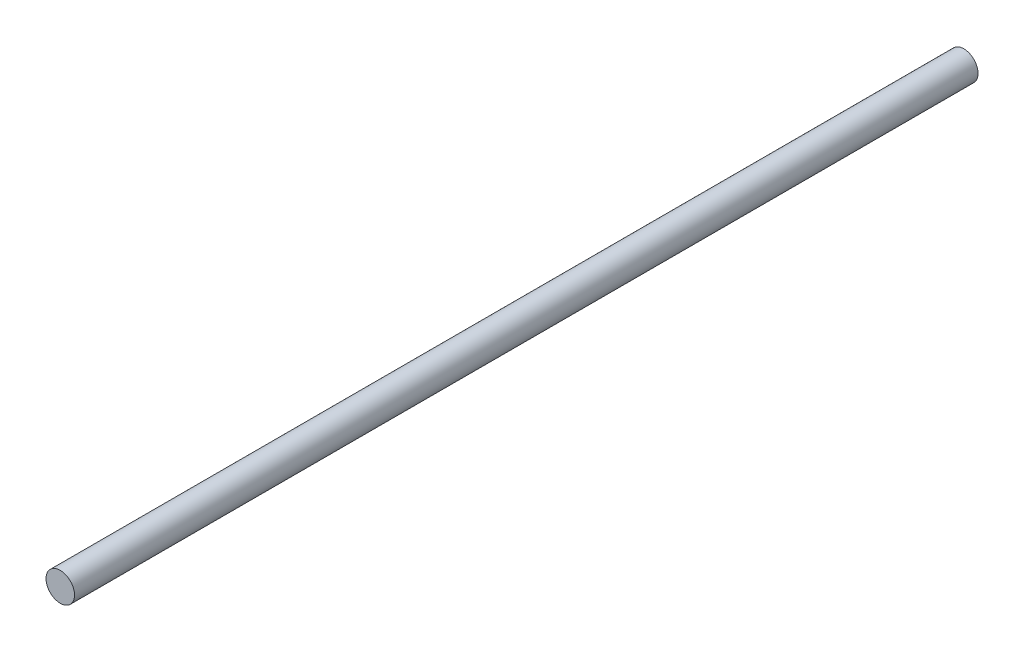
ISO-10303-21;
HEADER;
FILE_DESCRIPTION(('STEP AP214'),'2;1');
FILE_NAME('part.step','',(''),(''),'','','');
FILE_SCHEMA(('AUTOMOTIVE_DESIGN { 1 0 10303 214 1 1 1 1 }'));
ENDSEC;
DATA;
#1=APPLICATION_CONTEXT('core data for automotive mechanical design processes');
#2=APPLICATION_PROTOCOL_DEFINITION('international standard','automotive_design',2000,#1);
#3=PRODUCT_CONTEXT('',#1,'mechanical');
#4=PRODUCT('Part','Part','',(#3));
#5=PRODUCT_RELATED_PRODUCT_CATEGORY('part','',(#4));
#6=PRODUCT_DEFINITION_FORMATION('','',#4);
#7=PRODUCT_DEFINITION_CONTEXT('part definition',#1,'design');
#8=PRODUCT_DEFINITION('design','',#6,#7);
#9=PRODUCT_DEFINITION_SHAPE('','',#8);
#10=(LENGTH_UNIT() NAMED_UNIT(*) SI_UNIT(.MILLI.,.METRE.));
#11=(NAMED_UNIT(*) PLANE_ANGLE_UNIT() SI_UNIT($,.RADIAN.));
#12=(NAMED_UNIT(*) SI_UNIT($,.STERADIAN.) SOLID_ANGLE_UNIT());
#13=UNCERTAINTY_MEASURE_WITH_UNIT(LENGTH_MEASURE(1.E-05),#10,'distance_accuracy_value','');
#14=(GEOMETRIC_REPRESENTATION_CONTEXT(3) GLOBAL_UNCERTAINTY_ASSIGNED_CONTEXT((#13)) GLOBAL_UNIT_ASSIGNED_CONTEXT((#10,
#11,#12)) REPRESENTATION_CONTEXT('',''));
#15=CARTESIAN_POINT('',(0.,0.,0.));
#16=DIRECTION('',(0.,0.,1.));
#17=DIRECTION('',(1.,0.,0.));
#18=AXIS2_PLACEMENT_3D('',#15,#16,#17);
#19=CARTESIAN_POINT('',(0.,0.,950.));
#20=DIRECTION('',(0.,0.,-1.));
#21=DIRECTION('',(-1.,0.,0.));
#22=AXIS2_PLACEMENT_3D('',#19,#20,#21);
#23=CYLINDRICAL_SURFACE('',#22,15.);
#24=CARTESIAN_POINT('',(0.,0.,950.));
#25=DIRECTION('',(0.,0.,1.));
#26=DIRECTION('',(1.,0.,0.));
#27=AXIS2_PLACEMENT_3D('',#24,#25,#26);
#28=CIRCLE('',#27,15.);
#29=CARTESIAN_POINT('',(-15.,0.,950.));
#30=VERTEX_POINT('',#29);
#31=EDGE_CURVE('E10',#30,#30,#28,.T.);
#32=CARTESIAN_POINT('',(0.,0.,0.));
#33=DIRECTION('',(0.,0.,1.));
#34=DIRECTION('',(1.,0.,0.));
#35=AXIS2_PLACEMENT_3D('',#32,#33,#34);
#36=CIRCLE('',#35,15.);
#37=CARTESIAN_POINT('',(-15.,0.,-1.11022302462516E-13));
#38=VERTEX_POINT('',#37);
#39=EDGE_CURVE('E33',#38,#38,#36,.T.);
#40=CARTESIAN_POINT('',(-15.,0.,950.));
#41=CARTESIAN_POINT('',(-15.,0.,940.104166666667));
#42=CARTESIAN_POINT('',(-15.,0.,930.208333333333));
#43=CARTESIAN_POINT('',(-15.,0.,910.416666666667));
#44=CARTESIAN_POINT('',(-15.,0.,900.520833333333));
#45=CARTESIAN_POINT('',(-15.,0.,880.729166666667));
#46=CARTESIAN_POINT('',(-15.,0.,870.833333333333));
#47=CARTESIAN_POINT('',(-15.,0.,851.041666666667));
#48=CARTESIAN_POINT('',(-15.,0.,841.145833333333));
#49=CARTESIAN_POINT('',(-15.,0.,821.354166666667));
#50=CARTESIAN_POINT('',(-15.,0.,811.458333333333));
#51=CARTESIAN_POINT('',(-15.,0.,791.666666666667));
#52=CARTESIAN_POINT('',(-15.,0.,781.770833333333));
#53=CARTESIAN_POINT('',(-15.,0.,761.979166666667));
#54=CARTESIAN_POINT('',(-15.,0.,752.083333333333));
#55=CARTESIAN_POINT('',(-15.,0.,732.291666666667));
#56=CARTESIAN_POINT('',(-15.,0.,722.395833333333));
#57=CARTESIAN_POINT('',(-15.,0.,702.604166666667));
#58=CARTESIAN_POINT('',(-15.,0.,692.708333333333));
#59=CARTESIAN_POINT('',(-15.,0.,672.916666666667));
#60=CARTESIAN_POINT('',(-15.,0.,663.020833333333));
#61=CARTESIAN_POINT('',(-15.,0.,643.229166666667));
#62=CARTESIAN_POINT('',(-15.,0.,633.333333333333));
#63=CARTESIAN_POINT('',(-15.,0.,613.541666666667));
#64=CARTESIAN_POINT('',(-15.,0.,603.645833333333));
#65=CARTESIAN_POINT('',(-15.,0.,583.854166666667));
#66=CARTESIAN_POINT('',(-15.,0.,573.958333333333));
#67=CARTESIAN_POINT('',(-15.,0.,554.166666666667));
#68=CARTESIAN_POINT('',(-15.,0.,544.270833333333));
#69=CARTESIAN_POINT('',(-15.,0.,524.479166666667));
#70=CARTESIAN_POINT('',(-15.,0.,514.583333333333));
#71=CARTESIAN_POINT('',(-15.,0.,494.791666666667));
#72=CARTESIAN_POINT('',(-15.,0.,484.895833333333));
#73=CARTESIAN_POINT('',(-15.,0.,465.104166666667));
#74=CARTESIAN_POINT('',(-15.,0.,455.208333333333));
#75=CARTESIAN_POINT('',(-15.,0.,435.416666666667));
#76=CARTESIAN_POINT('',(-15.,0.,425.520833333333));
#77=CARTESIAN_POINT('',(-15.,0.,405.729166666667));
#78=CARTESIAN_POINT('',(-15.,0.,395.833333333333));
#79=CARTESIAN_POINT('',(-15.,0.,376.041666666667));
#80=CARTESIAN_POINT('',(-15.,0.,366.145833333333));
#81=CARTESIAN_POINT('',(-15.,0.,346.354166666667));
#82=CARTESIAN_POINT('',(-15.,0.,336.458333333333));
#83=CARTESIAN_POINT('',(-15.,0.,316.666666666667));
#84=CARTESIAN_POINT('',(-15.,0.,306.770833333333));
#85=CARTESIAN_POINT('',(-15.,0.,286.979166666667));
#86=CARTESIAN_POINT('',(-15.,0.,277.083333333333));
#87=CARTESIAN_POINT('',(-15.,0.,257.291666666667));
#88=CARTESIAN_POINT('',(-15.,0.,247.395833333333));
#89=CARTESIAN_POINT('',(-15.,0.,227.604166666667));
#90=CARTESIAN_POINT('',(-15.,0.,217.708333333333));
#91=CARTESIAN_POINT('',(-15.,0.,197.916666666667));
#92=CARTESIAN_POINT('',(-15.,0.,188.020833333333));
#93=CARTESIAN_POINT('',(-15.,0.,168.229166666667));
#94=CARTESIAN_POINT('',(-15.,0.,158.333333333333));
#95=CARTESIAN_POINT('',(-15.,0.,138.541666666667));
#96=CARTESIAN_POINT('',(-15.,0.,128.645833333333));
#97=CARTESIAN_POINT('',(-15.,0.,108.854166666667));
#98=CARTESIAN_POINT('',(-15.,0.,98.9583333333333));
#99=CARTESIAN_POINT('',(-15.,0.,79.1666666666666));
#100=CARTESIAN_POINT('',(-15.,0.,69.2708333333332));
#101=CARTESIAN_POINT('',(-15.,0.,49.4791666666665));
#102=CARTESIAN_POINT('',(-15.,0.,39.5833333333332));
#103=CARTESIAN_POINT('',(-15.,0.,19.7916666666665));
#104=CARTESIAN_POINT('',(-15.,0.,9.89583333333321));
#105=CARTESIAN_POINT('',(-15.,0.,-1.11022302462516E-13));
#106=B_SPLINE_CURVE_WITH_KNOTS('',3,(#40,#41,#42,#43,#44,#45,#46,#47,#48,#49,#50,#51,#52,#53,
#54,#55,#56,#57,#58,#59,#60,#61,#62,#63,#64,#65,#66,#67,#68,#69,#70,#71,#72,#73,#74,#75,#76,#77,
#78,#79,#80,#81,#82,#83,#84,#85,#86,#87,#88,#89,#90,#91,#92,#93,#94,#95,#96,#97,#98,#99,#100,
#101,#102,#103,#104,#105),.UNSPECIFIED.,.F.,.F.,(4,2,2,2,2,2,2,2,2,2,2,2,2,2,2,2,2,2,2,2,2,2,2,
2,2,2,2,2,2,2,2,2,4),(0.,29.6875000000001,59.3750000000001,89.0625,118.75,148.4375,178.125,
207.8125,237.5,267.1875,296.875,326.5625,356.25,385.9375,415.625,445.3125,475.,504.6875,534.375,
564.0625,593.75,623.4375,653.125,682.8125,712.5,742.1875,771.875,801.5625,831.25,860.9375,
890.625,920.3125,950.),.UNSPECIFIED.);
#107=EDGE_CURVE('BSEAM30',#30,#38,#106,.T.);
#108=ORIENTED_EDGE('',*,*,#31,.F.);
#109=ORIENTED_EDGE('',*,*,#39,.T.);
#110=ORIENTED_EDGE('',*,*,#107,.T.);
#111=ORIENTED_EDGE('',*,*,#107,.F.);
#112=EDGE_LOOP('',(#108,#110,#109,#111));
#113=FACE_BOUND('',#112,.T.);
#114=ADVANCED_FACE('F30',(#113),#23,.T.);
#115=CARTESIAN_POINT('',(0.,0.,950.));
#116=DIRECTION('',(0.,0.,1.));
#117=DIRECTION('',(1.,0.,0.));
#118=AXIS2_PLACEMENT_3D('',#115,#116,#117);
#119=PLANE('',#118);
#120=ORIENTED_EDGE('',*,*,#31,.T.);
#121=EDGE_LOOP('',(#120));
#122=FACE_BOUND('',#121,.T.);
#123=ADVANCED_FACE('F45',(#122),#119,.T.);
#124=CARTESIAN_POINT('',(0.,0.,0.));
#125=DIRECTION('',(0.,0.,1.));
#126=DIRECTION('',(1.,0.,0.));
#127=AXIS2_PLACEMENT_3D('',#124,#125,#126);
#128=PLANE('',#127);
#129=ORIENTED_EDGE('',*,*,#39,.F.);
#130=EDGE_LOOP('',(#129));
#131=FACE_BOUND('',#130,.T.);
#132=ADVANCED_FACE('F43',(#131),#128,.F.);
#133=CLOSED_SHELL('',(#114,#123,#132));
#134=MANIFOLD_SOLID_BREP('B2',#133);
#135=ADVANCED_BREP_SHAPE_REPRESENTATION('',(#18,#134),#14);
#136=SHAPE_DEFINITION_REPRESENTATION(#9,#135);
ENDSEC;
END-ISO-10303-21;
